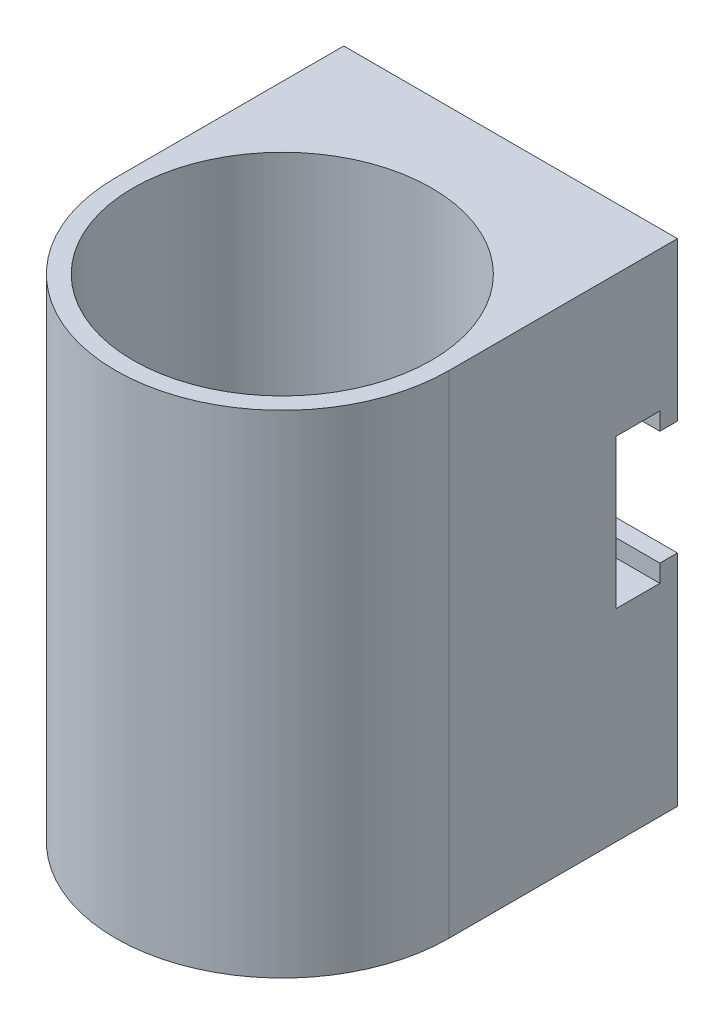
ISO-10303-21;
HEADER;
FILE_DESCRIPTION(('STEP AP214'),'2;1');
FILE_NAME('part.step','',(''),(''),'','','');
FILE_SCHEMA(('AUTOMOTIVE_DESIGN { 1 0 10303 214 1 1 1 1 }'));
ENDSEC;
DATA;
#1=APPLICATION_CONTEXT('core data for automotive mechanical design processes');
#2=APPLICATION_PROTOCOL_DEFINITION('international standard','automotive_design',2000,#1);
#3=PRODUCT_CONTEXT('',#1,'mechanical');
#4=PRODUCT('Part','Part','',(#3));
#5=PRODUCT_RELATED_PRODUCT_CATEGORY('part','',(#4));
#6=PRODUCT_DEFINITION_FORMATION('','',#4);
#7=PRODUCT_DEFINITION_CONTEXT('part definition',#1,'design');
#8=PRODUCT_DEFINITION('design','',#6,#7);
#9=PRODUCT_DEFINITION_SHAPE('','',#8);
#10=(LENGTH_UNIT() NAMED_UNIT(*) SI_UNIT(.MILLI.,.METRE.));
#11=(NAMED_UNIT(*) PLANE_ANGLE_UNIT() SI_UNIT($,.RADIAN.));
#12=(NAMED_UNIT(*) SI_UNIT($,.STERADIAN.) SOLID_ANGLE_UNIT());
#13=UNCERTAINTY_MEASURE_WITH_UNIT(LENGTH_MEASURE(1.E-05),#10,'distance_accuracy_value','');
#14=(GEOMETRIC_REPRESENTATION_CONTEXT(3) GLOBAL_UNCERTAINTY_ASSIGNED_CONTEXT((#13)) GLOBAL_UNIT_ASSIGNED_CONTEXT((#10,
#11,#12)) REPRESENTATION_CONTEXT('',''));
#15=CARTESIAN_POINT('',(0.,0.,0.));
#16=DIRECTION('',(0.,0.,1.));
#17=DIRECTION('',(1.,0.,0.));
#18=AXIS2_PLACEMENT_3D('',#15,#16,#17);
#19=CARTESIAN_POINT('',(-15.08125,44.45,-20.6375));
#20=DIRECTION('',(0.,0.,1.));
#21=DIRECTION('',(1.,0.,0.));
#22=AXIS2_PLACEMENT_3D('',#19,#20,#21);
#23=PLANE('',#22);
#24=DIRECTION('',(0.,-1.,0.));
#25=VECTOR('',#24,1.);
#26=CARTESIAN_POINT('',(-15.08125,44.45,-20.6375));
#27=LINE('',#26,#25);
#28=CARTESIAN_POINT('',(-15.08125,19.84375,-20.6375));
#29=VERTEX_POINT('',#28);
#30=CARTESIAN_POINT('',(-15.08125,0.,-20.6375));
#31=VERTEX_POINT('',#30);
#32=EDGE_CURVE('E152',#29,#31,#27,.T.);
#33=ORIENTED_EDGE('',*,*,#32,.F.);
#34=DIRECTION('',(1.,0.,0.));
#35=VECTOR('',#34,1.);
#36=CARTESIAN_POINT('',(-15.08125,19.84375,-20.6375));
#37=LINE('',#36,#35);
#38=CARTESIAN_POINT('',(15.08125,19.84375,-20.6375));
#39=VERTEX_POINT('',#38);
#40=EDGE_CURVE('E187',#29,#39,#37,.T.);
#41=ORIENTED_EDGE('',*,*,#40,.T.);
#42=DIRECTION('',(0.,-1.,0.));
#43=VECTOR('',#42,1.);
#44=CARTESIAN_POINT('',(15.08125,44.45,-20.6375));
#45=LINE('',#44,#43);
#46=CARTESIAN_POINT('',(15.08125,0.,-20.6375));
#47=VERTEX_POINT('',#46);
#48=EDGE_CURVE('E151',#39,#47,#45,.T.);
#49=ORIENTED_EDGE('',*,*,#48,.T.);
#50=DIRECTION('',(-1.,0.,0.));
#51=VECTOR('',#50,1.);
#52=CARTESIAN_POINT('',(-15.08125,0.,-20.6375));
#53=LINE('',#52,#51);
#54=EDGE_CURVE('E160',#47,#31,#53,.T.);
#55=ORIENTED_EDGE('',*,*,#54,.T.);
#56=EDGE_LOOP('',(#33,#41,#49,#55));
#57=FACE_BOUND('',#56,.T.);
#58=ADVANCED_FACE('F33',(#57),#23,.F.);
#59=CARTESIAN_POINT('',(0.,44.45,0.));
#60=DIRECTION('',(0.,-1.,0.));
#61=DIRECTION('',(0.,0.,-1.));
#62=AXIS2_PLACEMENT_3D('',#59,#60,#61);
#63=CYLINDRICAL_SURFACE('',#62,13.49375);
#64=CARTESIAN_POINT('',(0.,44.45,0.));
#65=DIRECTION('',(0.,1.,0.));
#66=DIRECTION('',(0.,0.,1.));
#67=AXIS2_PLACEMENT_3D('',#64,#65,#66);
#68=CIRCLE('',#67,13.49375);
#69=CARTESIAN_POINT('',(0.,44.45,13.49375));
#70=VERTEX_POINT('',#69);
#71=EDGE_CURVE('E168',#70,#70,#68,.T.);
#72=ORIENTED_EDGE('',*,*,#71,.T.);
#73=EDGE_LOOP('',(#72));
#74=FACE_BOUND('',#73,.T.);
#75=CARTESIAN_POINT('',(0.,1.5875,0.));
#76=DIRECTION('',(0.,-1.,0.));
#77=DIRECTION('',(0.,0.,-1.));
#78=AXIS2_PLACEMENT_3D('',#75,#76,#77);
#79=CIRCLE('',#78,13.49375);
#80=CARTESIAN_POINT('',(0.,1.5875,-13.49375));
#81=VERTEX_POINT('',#80);
#82=EDGE_CURVE('E37',#81,#81,#79,.T.);
#83=ORIENTED_EDGE('',*,*,#82,.T.);
#84=EDGE_LOOP('',(#83));
#85=FACE_BOUND('',#84,.T.);
#86=ADVANCED_FACE('F265',(#74,#85),#63,.F.);
#87=CARTESIAN_POINT('',(0.,44.45,0.));
#88=DIRECTION('',(0.,1.,0.));
#89=DIRECTION('',(0.,0.,1.));
#90=AXIS2_PLACEMENT_3D('',#87,#88,#89);
#91=PLANE('',#90);
#92=CARTESIAN_POINT('',(0.,44.45,0.));
#93=DIRECTION('',(0.,1.,0.));
#94=DIRECTION('',(0.,0.,1.));
#95=AXIS2_PLACEMENT_3D('',#92,#93,#94);
#96=CIRCLE('',#95,15.08125);
#97=CARTESIAN_POINT('',(-15.08125,44.45,0.));
#98=VERTEX_POINT('',#97);
#99=CARTESIAN_POINT('',(15.08125,44.45,0.));
#100=VERTEX_POINT('',#99);
#101=EDGE_CURVE('E159',#98,#100,#96,.T.);
#102=ORIENTED_EDGE('',*,*,#101,.T.);
#103=DIRECTION('',(0.,0.,-1.));
#104=VECTOR('',#103,1.);
#105=CARTESIAN_POINT('',(15.08125,44.45,-20.6375));
#106=LINE('',#105,#104);
#107=CARTESIAN_POINT('',(15.08125,44.45,-20.6375));
#108=VERTEX_POINT('',#107);
#109=EDGE_CURVE('E85',#100,#108,#106,.T.);
#110=ORIENTED_EDGE('',*,*,#109,.T.);
#111=DIRECTION('',(-1.,0.,0.));
#112=VECTOR('',#111,1.);
#113=CARTESIAN_POINT('',(-15.08125,44.45,-20.6375));
#114=LINE('',#113,#112);
#115=CARTESIAN_POINT('',(-15.08125,44.45,-20.6375));
#116=VERTEX_POINT('',#115);
#117=EDGE_CURVE('E170',#108,#116,#114,.T.);
#118=ORIENTED_EDGE('',*,*,#117,.T.);
#119=DIRECTION('',(0.,0.,1.));
#120=VECTOR('',#119,1.);
#121=CARTESIAN_POINT('',(-15.08125,44.45,0.));
#122=LINE('',#121,#120);
#123=EDGE_CURVE('E58',#116,#98,#122,.T.);
#124=ORIENTED_EDGE('',*,*,#123,.T.);
#125=EDGE_LOOP('',(#102,#110,#118,#124));
#126=FACE_BOUND('',#125,.T.);
#127=ORIENTED_EDGE('',*,*,#71,.F.);
#128=EDGE_LOOP('',(#127));
#129=FACE_BOUND('',#128,.T.);
#130=ADVANCED_FACE('F252',(#126,#129),#91,.T.);
#131=CARTESIAN_POINT('',(0.,0.,0.));
#132=DIRECTION('',(0.,1.,0.));
#133=DIRECTION('',(0.,0.,1.));
#134=AXIS2_PLACEMENT_3D('',#131,#132,#133);
#135=PLANE('',#134);
#136=DIRECTION('',(0.,0.,-1.));
#137=VECTOR('',#136,1.);
#138=CARTESIAN_POINT('',(15.08125,0.,-20.6375));
#139=LINE('',#138,#137);
#140=CARTESIAN_POINT('',(15.08125,0.,0.));
#141=VERTEX_POINT('',#140);
#142=EDGE_CURVE('E163',#141,#47,#139,.T.);
#143=ORIENTED_EDGE('',*,*,#142,.F.);
#144=CARTESIAN_POINT('',(0.,0.,0.));
#145=DIRECTION('',(0.,1.,0.));
#146=DIRECTION('',(0.,0.,1.));
#147=AXIS2_PLACEMENT_3D('',#144,#145,#146);
#148=CIRCLE('',#147,15.08125);
#149=CARTESIAN_POINT('',(-15.08125,0.,0.));
#150=VERTEX_POINT('',#149);
#151=EDGE_CURVE('E166',#150,#141,#148,.T.);
#152=ORIENTED_EDGE('',*,*,#151,.F.);
#153=DIRECTION('',(0.,0.,1.));
#154=VECTOR('',#153,1.);
#155=CARTESIAN_POINT('',(-15.08125,0.,0.));
#156=LINE('',#155,#154);
#157=EDGE_CURVE('E157',#31,#150,#156,.T.);
#158=ORIENTED_EDGE('',*,*,#157,.F.);
#159=ORIENTED_EDGE('',*,*,#54,.F.);
#160=EDGE_LOOP('',(#143,#152,#158,#159));
#161=FACE_BOUND('',#160,.T.);
#162=ADVANCED_FACE('F251',(#161),#135,.F.);
#163=CARTESIAN_POINT('',(0.,44.45,0.));
#164=DIRECTION('',(0.,-1.,0.));
#165=DIRECTION('',(0.,0.,-1.));
#166=AXIS2_PLACEMENT_3D('',#163,#164,#165);
#167=CYLINDRICAL_SURFACE('',#166,15.08125);
#168=ORIENTED_EDGE('',*,*,#151,.T.);
#169=DIRECTION('',(0.,-1.,0.));
#170=VECTOR('',#169,1.);
#171=CARTESIAN_POINT('',(15.08125,44.45,0.));
#172=LINE('',#171,#170);
#173=EDGE_CURVE('E11',#100,#141,#172,.T.);
#174=ORIENTED_EDGE('',*,*,#173,.F.);
#175=ORIENTED_EDGE('',*,*,#101,.F.);
#176=DIRECTION('',(0.,-1.,0.));
#177=VECTOR('',#176,1.);
#178=CARTESIAN_POINT('',(-15.08125,44.45,0.));
#179=LINE('',#178,#177);
#180=EDGE_CURVE('E78',#98,#150,#179,.T.);
#181=ORIENTED_EDGE('',*,*,#180,.T.);
#182=EDGE_LOOP('',(#168,#174,#175,#181));
#183=FACE_BOUND('',#182,.T.);
#184=ADVANCED_FACE('F35',(#183),#167,.T.);
#185=CARTESIAN_POINT('',(15.08125,44.45,-20.6375));
#186=DIRECTION('',(-1.,0.,0.));
#187=DIRECTION('',(0.,0.,1.));
#188=AXIS2_PLACEMENT_3D('',#185,#186,#187);
#189=PLANE('',#188);
#190=ORIENTED_EDGE('',*,*,#48,.F.);
#191=DIRECTION('',(0.,0.,-1.));
#192=VECTOR('',#191,1.);
#193=CARTESIAN_POINT('',(15.08125,19.84375,-19.05));
#194=LINE('',#193,#192);
#195=CARTESIAN_POINT('',(15.08125,19.84375,-19.05));
#196=VERTEX_POINT('',#195);
#197=EDGE_CURVE('E139',#196,#39,#194,.T.);
#198=ORIENTED_EDGE('',*,*,#197,.F.);
#199=DIRECTION('',(0.,1.,0.));
#200=VECTOR('',#199,1.);
#201=CARTESIAN_POINT('',(15.08125,18.25625,-19.05));
#202=LINE('',#201,#200);
#203=CARTESIAN_POINT('',(15.08125,18.25625,-19.05));
#204=VERTEX_POINT('',#203);
#205=EDGE_CURVE('E191',#204,#196,#202,.T.);
#206=ORIENTED_EDGE('',*,*,#205,.F.);
#207=DIRECTION('',(0.,0.,-1.));
#208=VECTOR('',#207,1.);
#209=CARTESIAN_POINT('',(15.08125,18.25625,-15.08125));
#210=LINE('',#209,#208);
#211=CARTESIAN_POINT('',(15.08125,18.25625,-15.08125));
#212=VERTEX_POINT('',#211);
#213=EDGE_CURVE('E194',#212,#204,#210,.T.);
#214=ORIENTED_EDGE('',*,*,#213,.F.);
#215=DIRECTION('',(0.,-1.,0.));
#216=VECTOR('',#215,1.);
#217=CARTESIAN_POINT('',(15.08125,31.75,-15.08125));
#218=LINE('',#217,#216);
#219=CARTESIAN_POINT('',(15.08125,31.75,-15.08125));
#220=VERTEX_POINT('',#219);
#221=EDGE_CURVE('E197',#220,#212,#218,.T.);
#222=ORIENTED_EDGE('',*,*,#221,.F.);
#223=DIRECTION('',(0.,0.,1.));
#224=VECTOR('',#223,1.);
#225=CARTESIAN_POINT('',(15.08125,31.75,-19.05));
#226=LINE('',#225,#224);
#227=CARTESIAN_POINT('',(15.08125,31.75,-19.05));
#228=VERTEX_POINT('',#227);
#229=EDGE_CURVE('E200',#228,#220,#226,.T.);
#230=ORIENTED_EDGE('',*,*,#229,.F.);
#231=DIRECTION('',(0.,1.,0.));
#232=VECTOR('',#231,1.);
#233=CARTESIAN_POINT('',(15.08125,30.1625,-19.05));
#234=LINE('',#233,#232);
#235=CARTESIAN_POINT('',(15.08125,30.1625,-19.05));
#236=VERTEX_POINT('',#235);
#237=EDGE_CURVE('E203',#236,#228,#234,.T.);
#238=ORIENTED_EDGE('',*,*,#237,.F.);
#239=DIRECTION('',(0.,0.,1.));
#240=VECTOR('',#239,1.);
#241=CARTESIAN_POINT('',(15.08125,30.1625,-20.6375));
#242=LINE('',#241,#240);
#243=CARTESIAN_POINT('',(15.08125,30.1625,-20.6375));
#244=VERTEX_POINT('',#243);
#245=EDGE_CURVE('E206',#244,#236,#242,.T.);
#246=ORIENTED_EDGE('',*,*,#245,.F.);
#247=EDGE_CURVE('E42',#108,#244,#45,.T.);
#248=ORIENTED_EDGE('',*,*,#247,.F.);
#249=ORIENTED_EDGE('',*,*,#109,.F.);
#250=ORIENTED_EDGE('',*,*,#173,.T.);
#251=ORIENTED_EDGE('',*,*,#142,.T.);
#252=EDGE_LOOP('',(#190,#198,#206,#214,#222,#230,#238,#246,#248,#249,#250,#251));
#253=FACE_BOUND('',#252,.T.);
#254=ADVANCED_FACE('F244',(#253),#189,.F.);
#255=ORIENTED_EDGE('',*,*,#247,.T.);
#256=DIRECTION('',(1.,0.,0.));
#257=VECTOR('',#256,1.);
#258=CARTESIAN_POINT('',(-15.08125,30.1625,-20.6375));
#259=LINE('',#258,#257);
#260=CARTESIAN_POINT('',(-15.08125,30.1625,-20.6375));
#261=VERTEX_POINT('',#260);
#262=EDGE_CURVE('E134',#261,#244,#259,.T.);
#263=ORIENTED_EDGE('',*,*,#262,.F.);
#264=EDGE_CURVE('E146',#116,#261,#27,.T.);
#265=ORIENTED_EDGE('',*,*,#264,.F.);
#266=ORIENTED_EDGE('',*,*,#117,.F.);
#267=EDGE_LOOP('',(#255,#263,#265,#266));
#268=FACE_BOUND('',#267,.T.);
#269=ADVANCED_FACE('F144',(#268),#23,.F.);
#270=CARTESIAN_POINT('',(-15.08125,44.45,0.));
#271=DIRECTION('',(1.,0.,0.));
#272=DIRECTION('',(0.,0.,-1.));
#273=AXIS2_PLACEMENT_3D('',#270,#271,#272);
#274=PLANE('',#273);
#275=DIRECTION('',(0.,1.,0.));
#276=VECTOR('',#275,1.);
#277=CARTESIAN_POINT('',(-15.08125,18.25625,-19.05));
#278=LINE('',#277,#276);
#279=CARTESIAN_POINT('',(-15.08125,18.25625,-19.05));
#280=VERTEX_POINT('',#279);
#281=CARTESIAN_POINT('',(-15.08125,19.84375,-19.05));
#282=VERTEX_POINT('',#281);
#283=EDGE_CURVE('E210',#280,#282,#278,.T.);
#284=ORIENTED_EDGE('',*,*,#283,.T.);
#285=DIRECTION('',(0.,0.,-1.));
#286=VECTOR('',#285,1.);
#287=CARTESIAN_POINT('',(-15.08125,19.84375,-19.05));
#288=LINE('',#287,#286);
#289=EDGE_CURVE('E147',#282,#29,#288,.T.);
#290=ORIENTED_EDGE('',*,*,#289,.T.);
#291=ORIENTED_EDGE('',*,*,#32,.T.);
#292=ORIENTED_EDGE('',*,*,#157,.T.);
#293=ORIENTED_EDGE('',*,*,#180,.F.);
#294=ORIENTED_EDGE('',*,*,#123,.F.);
#295=ORIENTED_EDGE('',*,*,#264,.T.);
#296=DIRECTION('',(0.,0.,1.));
#297=VECTOR('',#296,1.);
#298=CARTESIAN_POINT('',(-15.08125,30.1625,-20.6375));
#299=LINE('',#298,#297);
#300=CARTESIAN_POINT('',(-15.08125,30.1625,-19.05));
#301=VERTEX_POINT('',#300);
#302=EDGE_CURVE('E130',#261,#301,#299,.T.);
#303=ORIENTED_EDGE('',*,*,#302,.T.);
#304=DIRECTION('',(0.,1.,0.));
#305=VECTOR('',#304,1.);
#306=CARTESIAN_POINT('',(-15.08125,30.1625,-19.05));
#307=LINE('',#306,#305);
#308=CARTESIAN_POINT('',(-15.08125,31.75,-19.05));
#309=VERTEX_POINT('',#308);
#310=EDGE_CURVE('E49',#301,#309,#307,.T.);
#311=ORIENTED_EDGE('',*,*,#310,.T.);
#312=DIRECTION('',(0.,0.,1.));
#313=VECTOR('',#312,1.);
#314=CARTESIAN_POINT('',(-15.08125,31.75,-19.05));
#315=LINE('',#314,#313);
#316=CARTESIAN_POINT('',(-15.08125,31.75,-15.08125));
#317=VERTEX_POINT('',#316);
#318=EDGE_CURVE('E218',#309,#317,#315,.T.);
#319=ORIENTED_EDGE('',*,*,#318,.T.);
#320=DIRECTION('',(0.,-1.,0.));
#321=VECTOR('',#320,1.);
#322=CARTESIAN_POINT('',(-15.08125,31.75,-15.08125));
#323=LINE('',#322,#321);
#324=CARTESIAN_POINT('',(-15.08125,18.25625,-15.08125));
#325=VERTEX_POINT('',#324);
#326=EDGE_CURVE('E215',#317,#325,#323,.T.);
#327=ORIENTED_EDGE('',*,*,#326,.T.);
#328=DIRECTION('',(0.,0.,-1.));
#329=VECTOR('',#328,1.);
#330=CARTESIAN_POINT('',(-15.08125,18.25625,-15.08125));
#331=LINE('',#330,#329);
#332=EDGE_CURVE('E212',#325,#280,#331,.T.);
#333=ORIENTED_EDGE('',*,*,#332,.T.);
#334=EDGE_LOOP('',(#284,#290,#291,#292,#293,#294,#295,#303,#311,#319,#327,#333));
#335=FACE_BOUND('',#334,.T.);
#336=ADVANCED_FACE('F150',(#335),#274,.F.);
#337=CARTESIAN_POINT('',(0.,1.5875,0.));
#338=DIRECTION('',(0.,-1.,0.));
#339=DIRECTION('',(0.,0.,-1.));
#340=AXIS2_PLACEMENT_3D('',#337,#338,#339);
#341=PLANE('',#340);
#342=ORIENTED_EDGE('',*,*,#82,.F.);
#343=EDGE_LOOP('',(#342));
#344=FACE_BOUND('',#343,.T.);
#345=ADVANCED_FACE('F278',(#344),#341,.F.);
#346=CARTESIAN_POINT('',(-15.08125,19.84375,-19.05));
#347=DIRECTION('',(0.,-1.,0.));
#348=DIRECTION('',(0.,0.,-1.));
#349=AXIS2_PLACEMENT_3D('',#346,#347,#348);
#350=PLANE('',#349);
#351=ORIENTED_EDGE('',*,*,#197,.T.);
#352=ORIENTED_EDGE('',*,*,#40,.F.);
#353=ORIENTED_EDGE('',*,*,#289,.F.);
#354=DIRECTION('',(1.,0.,0.));
#355=VECTOR('',#354,1.);
#356=CARTESIAN_POINT('',(-15.08125,19.84375,-19.05));
#357=LINE('',#356,#355);
#358=EDGE_CURVE('E185',#282,#196,#357,.T.);
#359=ORIENTED_EDGE('',*,*,#358,.T.);
#360=EDGE_LOOP('',(#351,#352,#353,#359));
#361=FACE_BOUND('',#360,.T.);
#362=ADVANCED_FACE('F241',(#361),#350,.F.);
#363=CARTESIAN_POINT('',(-15.08125,18.25625,-19.05));
#364=DIRECTION('',(0.,0.,-1.));
#365=DIRECTION('',(-1.,0.,0.));
#366=AXIS2_PLACEMENT_3D('',#363,#364,#365);
#367=PLANE('',#366);
#368=ORIENTED_EDGE('',*,*,#205,.T.);
#369=ORIENTED_EDGE('',*,*,#358,.F.);
#370=ORIENTED_EDGE('',*,*,#283,.F.);
#371=DIRECTION('',(1.,0.,0.));
#372=VECTOR('',#371,1.);
#373=CARTESIAN_POINT('',(-15.08125,18.25625,-19.05));
#374=LINE('',#373,#372);
#375=EDGE_CURVE('E183',#280,#204,#374,.T.);
#376=ORIENTED_EDGE('',*,*,#375,.T.);
#377=EDGE_LOOP('',(#368,#369,#370,#376));
#378=FACE_BOUND('',#377,.T.);
#379=ADVANCED_FACE('F237',(#378),#367,.F.);
#380=CARTESIAN_POINT('',(-15.08125,18.25625,-15.08125));
#381=DIRECTION('',(0.,-1.,0.));
#382=DIRECTION('',(0.,0.,-1.));
#383=AXIS2_PLACEMENT_3D('',#380,#381,#382);
#384=PLANE('',#383);
#385=ORIENTED_EDGE('',*,*,#213,.T.);
#386=ORIENTED_EDGE('',*,*,#375,.F.);
#387=ORIENTED_EDGE('',*,*,#332,.F.);
#388=DIRECTION('',(1.,0.,0.));
#389=VECTOR('',#388,1.);
#390=CARTESIAN_POINT('',(-15.08125,18.25625,-15.08125));
#391=LINE('',#390,#389);
#392=EDGE_CURVE('E181',#325,#212,#391,.T.);
#393=ORIENTED_EDGE('',*,*,#392,.T.);
#394=EDGE_LOOP('',(#385,#386,#387,#393));
#395=FACE_BOUND('',#394,.T.);
#396=ADVANCED_FACE('F232',(#395),#384,.F.);
#397=CARTESIAN_POINT('',(-15.08125,31.75,-15.08125));
#398=DIRECTION('',(0.,0.,1.));
#399=DIRECTION('',(0.,-1.,0.));
#400=AXIS2_PLACEMENT_3D('',#397,#398,#399);
#401=PLANE('',#400);
#402=ORIENTED_EDGE('',*,*,#221,.T.);
#403=ORIENTED_EDGE('',*,*,#392,.F.);
#404=ORIENTED_EDGE('',*,*,#326,.F.);
#405=DIRECTION('',(1.,0.,0.));
#406=VECTOR('',#405,1.);
#407=CARTESIAN_POINT('',(-15.08125,31.75,-15.08125));
#408=LINE('',#407,#406);
#409=EDGE_CURVE('E179',#317,#220,#408,.T.);
#410=ORIENTED_EDGE('',*,*,#409,.T.);
#411=EDGE_LOOP('',(#402,#403,#404,#410));
#412=FACE_BOUND('',#411,.T.);
#413=ADVANCED_FACE('F228',(#412),#401,.F.);
#414=CARTESIAN_POINT('',(-15.08125,31.75,-19.05));
#415=DIRECTION('',(0.,1.,0.));
#416=DIRECTION('',(0.,0.,1.));
#417=AXIS2_PLACEMENT_3D('',#414,#415,#416);
#418=PLANE('',#417);
#419=ORIENTED_EDGE('',*,*,#229,.T.);
#420=ORIENTED_EDGE('',*,*,#409,.F.);
#421=ORIENTED_EDGE('',*,*,#318,.F.);
#422=DIRECTION('',(1.,0.,0.));
#423=VECTOR('',#422,1.);
#424=CARTESIAN_POINT('',(-15.08125,31.75,-19.05));
#425=LINE('',#424,#423);
#426=EDGE_CURVE('E177',#309,#228,#425,.T.);
#427=ORIENTED_EDGE('',*,*,#426,.T.);
#428=EDGE_LOOP('',(#419,#420,#421,#427));
#429=FACE_BOUND('',#428,.T.);
#430=ADVANCED_FACE('F224',(#429),#418,.F.);
#431=CARTESIAN_POINT('',(-15.08125,30.1625,-19.05));
#432=DIRECTION('',(0.,0.,-1.));
#433=DIRECTION('',(-1.,0.,0.));
#434=AXIS2_PLACEMENT_3D('',#431,#432,#433);
#435=PLANE('',#434);
#436=ORIENTED_EDGE('',*,*,#237,.T.);
#437=ORIENTED_EDGE('',*,*,#426,.F.);
#438=ORIENTED_EDGE('',*,*,#310,.F.);
#439=DIRECTION('',(1.,0.,0.));
#440=VECTOR('',#439,1.);
#441=CARTESIAN_POINT('',(-15.08125,30.1625,-19.05));
#442=LINE('',#441,#440);
#443=EDGE_CURVE('E136',#301,#236,#442,.T.);
#444=ORIENTED_EDGE('',*,*,#443,.T.);
#445=EDGE_LOOP('',(#436,#437,#438,#444));
#446=FACE_BOUND('',#445,.T.);
#447=ADVANCED_FACE('F255',(#446),#435,.F.);
#448=CARTESIAN_POINT('',(-15.08125,30.1625,-20.6375));
#449=DIRECTION('',(0.,1.,0.));
#450=DIRECTION('',(0.,0.,1.));
#451=AXIS2_PLACEMENT_3D('',#448,#449,#450);
#452=PLANE('',#451);
#453=ORIENTED_EDGE('',*,*,#245,.T.);
#454=ORIENTED_EDGE('',*,*,#443,.F.);
#455=ORIENTED_EDGE('',*,*,#302,.F.);
#456=ORIENTED_EDGE('',*,*,#262,.T.);
#457=EDGE_LOOP('',(#453,#454,#455,#456));
#458=FACE_BOUND('',#457,.T.);
#459=ADVANCED_FACE('F133',(#458),#452,.F.);
#460=CLOSED_SHELL('',(#58,#86,#130,#162,#184,#254,#269,#336,#345,#362,#379,#396,#413,#430,#447,#459));
#461=MANIFOLD_SOLID_BREP('B2',#460);
#462=ADVANCED_BREP_SHAPE_REPRESENTATION('',(#18,#461),#14);
#463=SHAPE_DEFINITION_REPRESENTATION(#9,#462);
ENDSEC;
END-ISO-10303-21;
